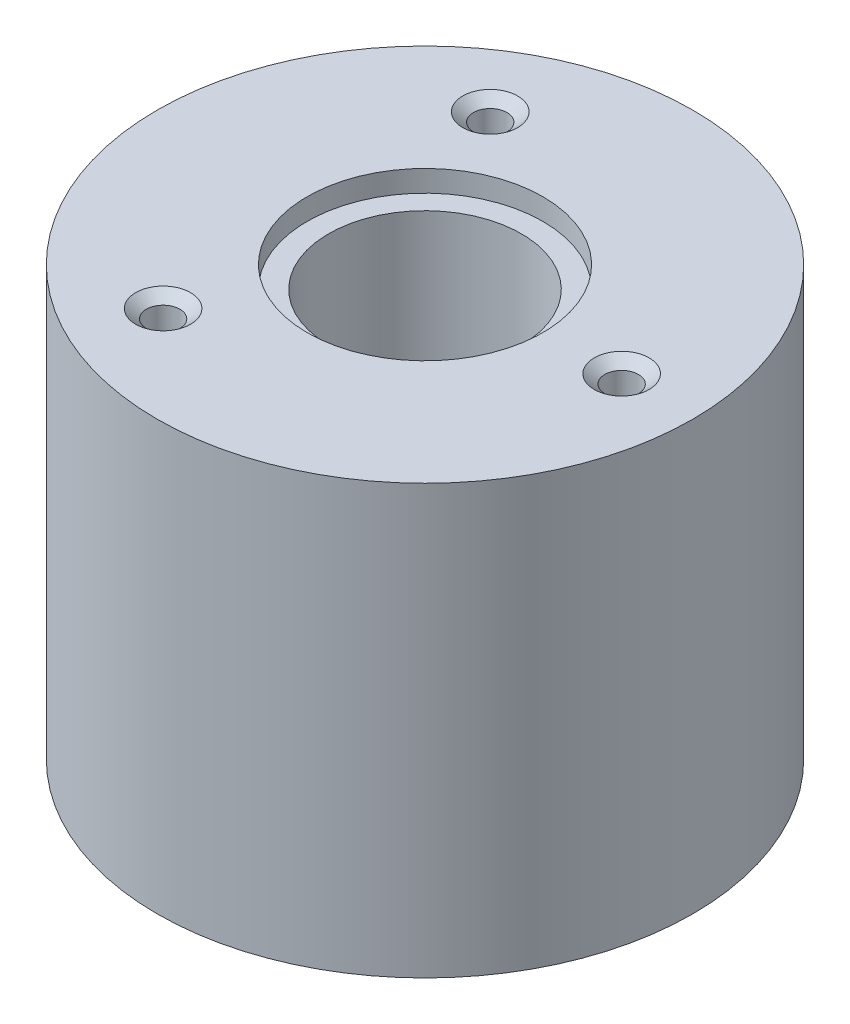
ISO-10303-21;
HEADER;
FILE_DESCRIPTION(('STEP AP214'),'2;1');
FILE_NAME('part.step','',(''),(''),'','','');
FILE_SCHEMA(('AUTOMOTIVE_DESIGN { 1 0 10303 214 1 1 1 1 }'));
ENDSEC;
DATA;
#1=APPLICATION_CONTEXT('core data for automotive mechanical design processes');
#2=APPLICATION_PROTOCOL_DEFINITION('international standard','automotive_design',2000,#1);
#3=PRODUCT_CONTEXT('',#1,'mechanical');
#4=PRODUCT('Part','Part','',(#3));
#5=PRODUCT_RELATED_PRODUCT_CATEGORY('part','',(#4));
#6=PRODUCT_DEFINITION_FORMATION('','',#4);
#7=PRODUCT_DEFINITION_CONTEXT('part definition',#1,'design');
#8=PRODUCT_DEFINITION('design','',#6,#7);
#9=PRODUCT_DEFINITION_SHAPE('','',#8);
#10=(LENGTH_UNIT() NAMED_UNIT(*) SI_UNIT(.MILLI.,.METRE.));
#11=(NAMED_UNIT(*) PLANE_ANGLE_UNIT() SI_UNIT($,.RADIAN.));
#12=(NAMED_UNIT(*) SI_UNIT($,.STERADIAN.) SOLID_ANGLE_UNIT());
#13=UNCERTAINTY_MEASURE_WITH_UNIT(LENGTH_MEASURE(1.E-05),#10,'distance_accuracy_value','');
#14=(GEOMETRIC_REPRESENTATION_CONTEXT(3) GLOBAL_UNCERTAINTY_ASSIGNED_CONTEXT((#13)) GLOBAL_UNIT_ASSIGNED_CONTEXT((#10,
#11,#12)) REPRESENTATION_CONTEXT('',''));
#15=CARTESIAN_POINT('',(0.,0.,0.));
#16=DIRECTION('',(0.,0.,1.));
#17=DIRECTION('',(1.,0.,0.));
#18=AXIS2_PLACEMENT_3D('',#15,#16,#17);
#19=CARTESIAN_POINT('',(0.,0.,0.));
#20=DIRECTION('',(0.,1.,0.));
#21=DIRECTION('',(0.,0.,1.));
#22=AXIS2_PLACEMENT_3D('',#19,#20,#21);
#23=CYLINDRICAL_SURFACE('',#22,5.715);
#24=CARTESIAN_POINT('',(0.,0.,0.));
#25=DIRECTION('',(0.,1.,0.));
#26=DIRECTION('',(0.,0.,1.));
#27=AXIS2_PLACEMENT_3D('',#24,#25,#26);
#28=CIRCLE('',#27,5.715);
#29=CARTESIAN_POINT('',(0.,0.,5.715));
#30=VERTEX_POINT('',#29);
#31=EDGE_CURVE('E141',#30,#30,#28,.T.);
#32=CARTESIAN_POINT('',(0.,24.13,0.));
#33=DIRECTION('',(0.,1.,0.));
#34=DIRECTION('',(0.,0.,1.));
#35=AXIS2_PLACEMENT_3D('',#32,#33,#34);
#36=CIRCLE('',#35,5.715);
#37=CARTESIAN_POINT('',(0.,24.13,5.715));
#38=VERTEX_POINT('',#37);
#39=EDGE_CURVE('E42',#38,#38,#36,.F.);
#40=CARTESIAN_POINT('',(0.,0.,5.715));
#41=CARTESIAN_POINT('',(0.,0.251354166666667,5.715));
#42=CARTESIAN_POINT('',(0.,0.502708333333333,5.715));
#43=CARTESIAN_POINT('',(0.,1.00541666666667,5.715));
#44=CARTESIAN_POINT('',(0.,1.25677083333333,5.715));
#45=CARTESIAN_POINT('',(0.,1.75947916666667,5.715));
#46=CARTESIAN_POINT('',(0.,2.01083333333333,5.715));
#47=CARTESIAN_POINT('',(0.,2.51354166666667,5.715));
#48=CARTESIAN_POINT('',(0.,2.76489583333333,5.715));
#49=CARTESIAN_POINT('',(0.,3.26760416666667,5.715));
#50=CARTESIAN_POINT('',(0.,3.51895833333333,5.715));
#51=CARTESIAN_POINT('',(0.,4.02166666666667,5.715));
#52=CARTESIAN_POINT('',(0.,4.27302083333333,5.715));
#53=CARTESIAN_POINT('',(0.,4.77572916666667,5.715));
#54=CARTESIAN_POINT('',(0.,5.02708333333333,5.715));
#55=CARTESIAN_POINT('',(0.,5.52979166666667,5.715));
#56=CARTESIAN_POINT('',(0.,5.78114583333333,5.715));
#57=CARTESIAN_POINT('',(0.,6.28385416666667,5.715));
#58=CARTESIAN_POINT('',(0.,6.53520833333333,5.715));
#59=CARTESIAN_POINT('',(0.,7.03791666666667,5.715));
#60=CARTESIAN_POINT('',(0.,7.28927083333333,5.715));
#61=CARTESIAN_POINT('',(0.,7.79197916666667,5.715));
#62=CARTESIAN_POINT('',(0.,8.04333333333333,5.715));
#63=CARTESIAN_POINT('',(0.,8.54604166666667,5.715));
#64=CARTESIAN_POINT('',(0.,8.79739583333333,5.715));
#65=CARTESIAN_POINT('',(0.,9.30010416666667,5.715));
#66=CARTESIAN_POINT('',(0.,9.55145833333333,5.715));
#67=CARTESIAN_POINT('',(0.,10.0541666666667,5.715));
#68=CARTESIAN_POINT('',(0.,10.3055208333333,5.715));
#69=CARTESIAN_POINT('',(0.,10.8082291666667,5.715));
#70=CARTESIAN_POINT('',(0.,11.0595833333333,5.715));
#71=CARTESIAN_POINT('',(0.,11.5622916666667,5.715));
#72=CARTESIAN_POINT('',(0.,11.8136458333333,5.715));
#73=CARTESIAN_POINT('',(0.,12.3163541666667,5.715));
#74=CARTESIAN_POINT('',(0.,12.5677083333333,5.715));
#75=CARTESIAN_POINT('',(0.,13.0704166666667,5.715));
#76=CARTESIAN_POINT('',(0.,13.3217708333333,5.715));
#77=CARTESIAN_POINT('',(0.,13.8244791666667,5.715));
#78=CARTESIAN_POINT('',(0.,14.0758333333333,5.715));
#79=CARTESIAN_POINT('',(0.,14.5785416666667,5.715));
#80=CARTESIAN_POINT('',(0.,14.8298958333333,5.715));
#81=CARTESIAN_POINT('',(0.,15.3326041666667,5.715));
#82=CARTESIAN_POINT('',(0.,15.5839583333333,5.715));
#83=CARTESIAN_POINT('',(0.,16.0866666666667,5.715));
#84=CARTESIAN_POINT('',(0.,16.3380208333333,5.715));
#85=CARTESIAN_POINT('',(0.,16.8407291666667,5.715));
#86=CARTESIAN_POINT('',(0.,17.0920833333333,5.715));
#87=CARTESIAN_POINT('',(0.,17.5947916666667,5.715));
#88=CARTESIAN_POINT('',(0.,17.8461458333333,5.715));
#89=CARTESIAN_POINT('',(0.,18.3488541666667,5.715));
#90=CARTESIAN_POINT('',(0.,18.6002083333333,5.715));
#91=CARTESIAN_POINT('',(0.,19.1029166666667,5.715));
#92=CARTESIAN_POINT('',(0.,19.3542708333333,5.715));
#93=CARTESIAN_POINT('',(0.,19.8569791666667,5.715));
#94=CARTESIAN_POINT('',(0.,20.1083333333333,5.715));
#95=CARTESIAN_POINT('',(0.,20.6110416666667,5.715));
#96=CARTESIAN_POINT('',(0.,20.8623958333333,5.715));
#97=CARTESIAN_POINT('',(0.,21.3651041666667,5.715));
#98=CARTESIAN_POINT('',(0.,21.6164583333333,5.715));
#99=CARTESIAN_POINT('',(0.,22.1191666666667,5.715));
#100=CARTESIAN_POINT('',(0.,22.3705208333333,5.715));
#101=CARTESIAN_POINT('',(0.,22.8732291666667,5.715));
#102=CARTESIAN_POINT('',(0.,23.1245833333333,5.715));
#103=CARTESIAN_POINT('',(0.,23.6272916666667,5.715));
#104=CARTESIAN_POINT('',(0.,23.8786458333333,5.715));
#105=CARTESIAN_POINT('',(0.,24.13,5.715));
#106=B_SPLINE_CURVE_WITH_KNOTS('',3,(#40,#41,#42,#43,#44,#45,#46,#47,#48,#49,#50,#51,#52,#53,
#54,#55,#56,#57,#58,#59,#60,#61,#62,#63,#64,#65,#66,#67,#68,#69,#70,#71,#72,#73,#74,#75,#76,#77,
#78,#79,#80,#81,#82,#83,#84,#85,#86,#87,#88,#89,#90,#91,#92,#93,#94,#95,#96,#97,#98,#99,#100,
#101,#102,#103,#104,#105),.UNSPECIFIED.,.F.,.F.,(4,2,2,2,2,2,2,2,2,2,2,2,2,2,2,2,2,2,2,2,2,2,2,
2,2,2,2,2,2,2,2,2,4),(0.,0.7540625,1.508125,2.2621875,3.01625,3.7703125,4.524375,5.2784375,
6.0325,6.7865625,7.540625,8.2946875,9.04875,9.8028125,10.556875,11.3109375,12.065,12.8190625,
13.573125,14.3271875,15.08125,15.8353125,16.589375,17.3434375,18.0975,18.8515625,19.605625,
20.3596875,21.11375,21.8678125,22.621875,23.3759375,24.13),.UNSPECIFIED.);
#107=EDGE_CURVE('BSEAM38',#30,#38,#106,.T.);
#108=ORIENTED_EDGE('',*,*,#31,.F.);
#109=ORIENTED_EDGE('',*,*,#39,.F.);
#110=ORIENTED_EDGE('',*,*,#107,.T.);
#111=ORIENTED_EDGE('',*,*,#107,.F.);
#112=EDGE_LOOP('',(#108,#110,#109,#111));
#113=FACE_BOUND('',#112,.T.);
#114=ADVANCED_FACE('F38',(#113),#23,.F.);
#115=CARTESIAN_POINT('',(0.,25.4,0.));
#116=DIRECTION('',(0.,-1.,0.));
#117=DIRECTION('',(0.,0.,-1.));
#118=AXIS2_PLACEMENT_3D('',#115,#116,#117);
#119=CYLINDRICAL_SURFACE('',#118,15.875);
#120=CARTESIAN_POINT('',(0.,25.4,0.));
#121=DIRECTION('',(0.,1.,0.));
#122=DIRECTION('',(0.,0.,1.));
#123=AXIS2_PLACEMENT_3D('',#120,#121,#122);
#124=CIRCLE('',#123,15.875);
#125=CARTESIAN_POINT('',(0.,25.4,-15.875));
#126=VERTEX_POINT('',#125);
#127=EDGE_CURVE('E11',#126,#126,#124,.T.);
#128=CARTESIAN_POINT('',(0.,0.,0.));
#129=DIRECTION('',(0.,1.,0.));
#130=DIRECTION('',(0.,0.,1.));
#131=AXIS2_PLACEMENT_3D('',#128,#129,#130);
#132=CIRCLE('',#131,15.875);
#133=CARTESIAN_POINT('',(0.,0.,-15.875));
#134=VERTEX_POINT('',#133);
#135=EDGE_CURVE('E47',#134,#134,#132,.T.);
#136=CARTESIAN_POINT('',(0.,25.4,-15.875));
#137=CARTESIAN_POINT('',(0.,25.1354166666667,-15.875));
#138=CARTESIAN_POINT('',(0.,24.8708333333333,-15.875));
#139=CARTESIAN_POINT('',(0.,24.3416666666667,-15.875));
#140=CARTESIAN_POINT('',(0.,24.0770833333333,-15.875));
#141=CARTESIAN_POINT('',(0.,23.5479166666667,-15.875));
#142=CARTESIAN_POINT('',(0.,23.2833333333333,-15.875));
#143=CARTESIAN_POINT('',(0.,22.7541666666667,-15.875));
#144=CARTESIAN_POINT('',(0.,22.4895833333333,-15.875));
#145=CARTESIAN_POINT('',(0.,21.9604166666667,-15.875));
#146=CARTESIAN_POINT('',(0.,21.6958333333333,-15.875));
#147=CARTESIAN_POINT('',(0.,21.1666666666667,-15.875));
#148=CARTESIAN_POINT('',(0.,20.9020833333333,-15.875));
#149=CARTESIAN_POINT('',(0.,20.3729166666667,-15.875));
#150=CARTESIAN_POINT('',(0.,20.1083333333333,-15.875));
#151=CARTESIAN_POINT('',(0.,19.5791666666667,-15.875));
#152=CARTESIAN_POINT('',(0.,19.3145833333333,-15.875));
#153=CARTESIAN_POINT('',(0.,18.7854166666667,-15.875));
#154=CARTESIAN_POINT('',(0.,18.5208333333333,-15.875));
#155=CARTESIAN_POINT('',(0.,17.9916666666667,-15.875));
#156=CARTESIAN_POINT('',(0.,17.7270833333333,-15.875));
#157=CARTESIAN_POINT('',(0.,17.1979166666667,-15.875));
#158=CARTESIAN_POINT('',(0.,16.9333333333333,-15.875));
#159=CARTESIAN_POINT('',(0.,16.4041666666667,-15.875));
#160=CARTESIAN_POINT('',(0.,16.1395833333333,-15.875));
#161=CARTESIAN_POINT('',(0.,15.6104166666667,-15.875));
#162=CARTESIAN_POINT('',(0.,15.3458333333333,-15.875));
#163=CARTESIAN_POINT('',(0.,14.8166666666667,-15.875));
#164=CARTESIAN_POINT('',(0.,14.5520833333333,-15.875));
#165=CARTESIAN_POINT('',(0.,14.0229166666667,-15.875));
#166=CARTESIAN_POINT('',(0.,13.7583333333333,-15.875));
#167=CARTESIAN_POINT('',(0.,13.2291666666667,-15.875));
#168=CARTESIAN_POINT('',(0.,12.9645833333333,-15.875));
#169=CARTESIAN_POINT('',(0.,12.4354166666667,-15.875));
#170=CARTESIAN_POINT('',(0.,12.1708333333333,-15.875));
#171=CARTESIAN_POINT('',(0.,11.6416666666667,-15.875));
#172=CARTESIAN_POINT('',(0.,11.3770833333333,-15.875));
#173=CARTESIAN_POINT('',(0.,10.8479166666667,-15.875));
#174=CARTESIAN_POINT('',(0.,10.5833333333333,-15.875));
#175=CARTESIAN_POINT('',(0.,10.0541666666667,-15.875));
#176=CARTESIAN_POINT('',(0.,9.78958333333334,-15.875));
#177=CARTESIAN_POINT('',(0.,9.26041666666667,-15.875));
#178=CARTESIAN_POINT('',(0.,8.99583333333333,-15.875));
#179=CARTESIAN_POINT('',(0.,8.46666666666667,-15.875));
#180=CARTESIAN_POINT('',(0.,8.20208333333333,-15.875));
#181=CARTESIAN_POINT('',(0.,7.67291666666667,-15.875));
#182=CARTESIAN_POINT('',(0.,7.40833333333333,-15.875));
#183=CARTESIAN_POINT('',(0.,6.87916666666667,-15.875));
#184=CARTESIAN_POINT('',(0.,6.61458333333333,-15.875));
#185=CARTESIAN_POINT('',(0.,6.08541666666667,-15.875));
#186=CARTESIAN_POINT('',(0.,5.82083333333333,-15.875));
#187=CARTESIAN_POINT('',(0.,5.29166666666667,-15.875));
#188=CARTESIAN_POINT('',(0.,5.02708333333333,-15.875));
#189=CARTESIAN_POINT('',(0.,4.49791666666667,-15.875));
#190=CARTESIAN_POINT('',(0.,4.23333333333333,-15.875));
#191=CARTESIAN_POINT('',(0.,3.70416666666667,-15.875));
#192=CARTESIAN_POINT('',(0.,3.43958333333333,-15.875));
#193=CARTESIAN_POINT('',(0.,2.91041666666667,-15.875));
#194=CARTESIAN_POINT('',(0.,2.64583333333333,-15.875));
#195=CARTESIAN_POINT('',(0.,2.11666666666667,-15.875));
#196=CARTESIAN_POINT('',(0.,1.85208333333333,-15.875));
#197=CARTESIAN_POINT('',(0.,1.32291666666667,-15.875));
#198=CARTESIAN_POINT('',(0.,1.05833333333333,-15.875));
#199=CARTESIAN_POINT('',(0.,0.529166666666666,-15.875));
#200=CARTESIAN_POINT('',(0.,0.264583333333333,-15.875));
#201=CARTESIAN_POINT('',(0.,0.,-15.875));
#202=B_SPLINE_CURVE_WITH_KNOTS('',3,(#136,#137,#138,#139,#140,#141,#142,#143,#144,#145,#146,
#147,#148,#149,#150,#151,#152,#153,#154,#155,#156,#157,#158,#159,#160,#161,#162,#163,#164,#165,
#166,#167,#168,#169,#170,#171,#172,#173,#174,#175,#176,#177,#178,#179,#180,#181,#182,#183,#184,
#185,#186,#187,#188,#189,#190,#191,#192,#193,#194,#195,#196,#197,#198,#199,#200,#201),
.UNSPECIFIED.,.F.,.F.,(4,2,2,2,2,2,2,2,2,2,2,2,2,2,2,2,2,2,2,2,2,2,2,2,2,2,2,2,2,2,2,2,4),(0.,
0.793749999999999,1.5875,2.38125,3.175,3.96875,4.7625,5.55625,6.35,7.14375,7.9375,8.73125,9.525,
10.31875,11.1125,11.90625,12.7,13.49375,14.2875,15.08125,15.875,16.66875,17.4625,18.25625,19.05,
19.84375,20.6375,21.43125,22.225,23.01875,23.8125,24.60625,25.4),.UNSPECIFIED.);
#203=EDGE_CURVE('BSEAM40',#126,#134,#202,.T.);
#204=ORIENTED_EDGE('',*,*,#127,.F.);
#205=ORIENTED_EDGE('',*,*,#135,.T.);
#206=ORIENTED_EDGE('',*,*,#203,.T.);
#207=ORIENTED_EDGE('',*,*,#203,.F.);
#208=EDGE_LOOP('',(#204,#206,#205,#207));
#209=FACE_BOUND('',#208,.T.);
#210=ADVANCED_FACE('F40',(#209),#119,.T.);
#211=CARTESIAN_POINT('',(0.,25.4,0.));
#212=DIRECTION('',(0.,1.,0.));
#213=DIRECTION('',(0.,0.,1.));
#214=AXIS2_PLACEMENT_3D('',#211,#212,#213);
#215=PLANE('',#214);
#216=CARTESIAN_POINT('',(-5.51347809915412,25.4,10.0123153790793));
#217=DIRECTION('',(0.,1.,0.));
#218=DIRECTION('',(0.,0.,1.));
#219=AXIS2_PLACEMENT_3D('',#216,#217,#218);
#220=CIRCLE('',#219,1.627251);
#221=CARTESIAN_POINT('',(-5.51347809915412,25.4,11.6395663790793));
#222=VERTEX_POINT('',#221);
#223=EDGE_CURVE('E96',#222,#222,#220,.T.);
#224=ORIENTED_EDGE('',*,*,#223,.F.);
#225=EDGE_LOOP('',(#224));
#226=FACE_BOUND('',#225,.T.);
#227=CARTESIAN_POINT('',(11.4276585185614,25.4,-0.231345592463095));
#228=DIRECTION('',(0.,1.,0.));
#229=DIRECTION('',(0.,0.,1.));
#230=AXIS2_PLACEMENT_3D('',#227,#228,#229);
#231=CIRCLE('',#230,1.627251);
#232=CARTESIAN_POINT('',(11.4276585185614,25.4,1.3959054075369));
#233=VERTEX_POINT('',#232);
#234=EDGE_CURVE('E105',#233,#233,#231,.T.);
#235=ORIENTED_EDGE('',*,*,#234,.F.);
#236=EDGE_LOOP('',(#235));
#237=FACE_BOUND('',#236,.T.);
#238=CARTESIAN_POINT('',(-5.91418041940732,25.4,-9.7809697866162));
#239=DIRECTION('',(0.,1.,0.));
#240=DIRECTION('',(0.,0.,1.));
#241=AXIS2_PLACEMENT_3D('',#238,#239,#240);
#242=CIRCLE('',#241,1.627251);
#243=CARTESIAN_POINT('',(-5.91418041940732,25.4,-8.1537187866162));
#244=VERTEX_POINT('',#243);
#245=EDGE_CURVE('E114',#244,#244,#242,.T.);
#246=ORIENTED_EDGE('',*,*,#245,.F.);
#247=EDGE_LOOP('',(#246));
#248=FACE_BOUND('',#247,.T.);
#249=CARTESIAN_POINT('',(0.,25.4,0.));
#250=DIRECTION('',(0.,1.,0.));
#251=DIRECTION('',(0.,0.,1.));
#252=AXIS2_PLACEMENT_3D('',#249,#250,#251);
#253=CIRCLE('',#252,6.985);
#254=CARTESIAN_POINT('',(0.,25.4,6.985));
#255=VERTEX_POINT('',#254);
#256=EDGE_CURVE('E135',#255,#255,#253,.T.);
#257=ORIENTED_EDGE('',*,*,#256,.F.);
#258=EDGE_LOOP('',(#257));
#259=FACE_BOUND('',#258,.T.);
#260=ORIENTED_EDGE('',*,*,#127,.T.);
#261=EDGE_LOOP('',(#260));
#262=FACE_BOUND('',#261,.T.);
#263=ADVANCED_FACE('F150',(#226,#237,#248,#259,#262),#215,.T.);
#264=CARTESIAN_POINT('',(0.,0.,0.));
#265=DIRECTION('',(0.,1.,0.));
#266=DIRECTION('',(0.,0.,1.));
#267=AXIS2_PLACEMENT_3D('',#264,#265,#266);
#268=PLANE('',#267);
#269=CARTESIAN_POINT('',(3.21402259693411,0.,10.6375615155165));
#270=DIRECTION('',(0.,-1.,0.));
#271=DIRECTION('',(0.,0.,-1.));
#272=AXIS2_PLACEMENT_3D('',#269,#270,#271);
#273=CIRCLE('',#272,1.42875);
#274=CARTESIAN_POINT('',(3.21402259693411,0.,9.20881151551646));
#275=VERTEX_POINT('',#274);
#276=EDGE_CURVE('E87',#275,#275,#273,.T.);
#277=ORIENTED_EDGE('',*,*,#276,.F.);
#278=EDGE_LOOP('',(#277));
#279=FACE_BOUND('',#278,.T.);
#280=CARTESIAN_POINT('',(-3.21402259693411,0.,-10.6375615155165));
#281=DIRECTION('',(0.,-1.,0.));
#282=DIRECTION('',(0.,0.,-1.));
#283=AXIS2_PLACEMENT_3D('',#280,#281,#282);
#284=CIRCLE('',#283,1.42875);
#285=CARTESIAN_POINT('',(-3.21402259693411,0.,-12.0663115155165));
#286=VERTEX_POINT('',#285);
#287=EDGE_CURVE('E80',#286,#286,#284,.T.);
#288=ORIENTED_EDGE('',*,*,#287,.F.);
#289=EDGE_LOOP('',(#288));
#290=FACE_BOUND('',#289,.T.);
#291=CARTESIAN_POINT('',(-8.91738444421453,0.,-6.43673098991826));
#292=DIRECTION('',(0.,-1.,0.));
#293=DIRECTION('',(0.,0.,-1.));
#294=AXIS2_PLACEMENT_3D('',#291,#292,#293);
#295=CIRCLE('',#294,3.17499999999999);
#296=CARTESIAN_POINT('',(-8.91738444421453,0.,-9.61173098991825));
#297=VERTEX_POINT('',#296);
#298=EDGE_CURVE('E123',#297,#297,#295,.T.);
#299=ORIENTED_EDGE('',*,*,#298,.F.);
#300=EDGE_LOOP('',(#299));
#301=FACE_BOUND('',#300,.T.);
#302=CARTESIAN_POINT('',(8.91738444421453,0.,6.43673098991826));
#303=DIRECTION('',(0.,-1.,0.));
#304=DIRECTION('',(0.,0.,-1.));
#305=AXIS2_PLACEMENT_3D('',#302,#303,#304);
#306=CIRCLE('',#305,3.17499999999999);
#307=CARTESIAN_POINT('',(8.91738444421453,0.,3.26173098991827));
#308=VERTEX_POINT('',#307);
#309=EDGE_CURVE('E129',#308,#308,#306,.T.);
#310=ORIENTED_EDGE('',*,*,#309,.F.);
#311=EDGE_LOOP('',(#310));
#312=FACE_BOUND('',#311,.T.);
#313=ORIENTED_EDGE('',*,*,#31,.T.);
#314=EDGE_LOOP('',(#313));
#315=FACE_BOUND('',#314,.T.);
#316=ORIENTED_EDGE('',*,*,#135,.F.);
#317=EDGE_LOOP('',(#316));
#318=FACE_BOUND('',#317,.T.);
#319=ADVANCED_FACE('F147',(#279,#290,#301,#312,#315,#318),#268,.F.);
#320=CARTESIAN_POINT('',(0.,24.13,0.));
#321=DIRECTION('',(0.,1.,0.));
#322=DIRECTION('',(0.,0.,1.));
#323=AXIS2_PLACEMENT_3D('',#320,#321,#322);
#324=PLANE('',#323);
#325=CARTESIAN_POINT('',(0.,24.13,0.));
#326=DIRECTION('',(0.,1.,0.));
#327=DIRECTION('',(0.,0.,1.));
#328=AXIS2_PLACEMENT_3D('',#325,#326,#327);
#329=CIRCLE('',#328,6.985);
#330=CARTESIAN_POINT('',(0.,24.13,6.985));
#331=VERTEX_POINT('',#330);
#332=EDGE_CURVE('E136',#331,#331,#329,.T.);
#333=ORIENTED_EDGE('',*,*,#332,.T.);
#334=EDGE_LOOP('',(#333));
#335=FACE_BOUND('',#334,.T.);
#336=ORIENTED_EDGE('',*,*,#39,.T.);
#337=EDGE_LOOP('',(#336));
#338=FACE_BOUND('',#337,.T.);
#339=ADVANCED_FACE('F149',(#335,#338),#324,.T.);
#340=CARTESIAN_POINT('',(0.,24.13,0.));
#341=DIRECTION('',(0.,1.,0.));
#342=DIRECTION('',(0.,0.,1.));
#343=AXIS2_PLACEMENT_3D('',#340,#341,#342);
#344=CYLINDRICAL_SURFACE('',#343,6.985);
#345=ORIENTED_EDGE('',*,*,#332,.F.);
#346=EDGE_LOOP('',(#345));
#347=FACE_BOUND('',#346,.T.);
#348=ORIENTED_EDGE('',*,*,#256,.T.);
#349=EDGE_LOOP('',(#348));
#350=FACE_BOUND('',#349,.T.);
#351=ADVANCED_FACE('F156',(#347,#350),#344,.F.);
#352=CARTESIAN_POINT('',(8.91738444421453,19.05,6.43673098991826));
#353=DIRECTION('',(0.,-1.,0.));
#354=DIRECTION('',(0.,0.,-1.));
#355=AXIS2_PLACEMENT_3D('',#352,#353,#354);
#356=CONICAL_SURFACE('',#355,3.17499999999999,1.02974425867665);
#357=CARTESIAN_POINT('',(8.91738444421452,20.9577324654125,6.43673098991826));
#358=VERTEX_POINT('',#357);
#359=VERTEX_LOOP('',#358);
#360=FACE_BOUND('',#359,.T.);
#361=CARTESIAN_POINT('',(8.91738444421453,19.05,6.43673098991826));
#362=DIRECTION('',(0.,-1.,0.));
#363=DIRECTION('',(0.,0.,-1.));
#364=AXIS2_PLACEMENT_3D('',#361,#362,#363);
#365=CIRCLE('',#364,3.17499999999999);
#366=CARTESIAN_POINT('',(8.91738444421453,19.05,3.26173098991827));
#367=VERTEX_POINT('',#366);
#368=EDGE_CURVE('E132',#367,#367,#365,.T.);
#369=ORIENTED_EDGE('',*,*,#368,.T.);
#370=EDGE_LOOP('',(#369));
#371=FACE_BOUND('',#370,.T.);
#372=ADVANCED_FACE('F174',(#360,#371),#356,.F.);
#373=CARTESIAN_POINT('',(8.91738444421453,0.,6.43673098991826));
#374=DIRECTION('',(0.,-1.,0.));
#375=DIRECTION('',(0.,0.,-1.));
#376=AXIS2_PLACEMENT_3D('',#373,#374,#375);
#377=CYLINDRICAL_SURFACE('',#376,3.17499999999999);
#378=ORIENTED_EDGE('',*,*,#368,.F.);
#379=EDGE_LOOP('',(#378));
#380=FACE_BOUND('',#379,.T.);
#381=ORIENTED_EDGE('',*,*,#309,.T.);
#382=EDGE_LOOP('',(#381));
#383=FACE_BOUND('',#382,.T.);
#384=ADVANCED_FACE('F179',(#380,#383),#377,.F.);
#385=CARTESIAN_POINT('',(-8.91738444421453,19.05,-6.43673098991826));
#386=DIRECTION('',(0.,-1.,0.));
#387=DIRECTION('',(0.,0.,-1.));
#388=AXIS2_PLACEMENT_3D('',#385,#386,#387);
#389=CONICAL_SURFACE('',#388,3.17499999999999,1.02974425867665);
#390=CARTESIAN_POINT('',(-8.91738444421453,20.9577324654125,-6.43673098991826));
#391=VERTEX_POINT('',#390);
#392=VERTEX_LOOP('',#391);
#393=FACE_BOUND('',#392,.T.);
#394=CARTESIAN_POINT('',(-8.91738444421453,19.05,-6.43673098991826));
#395=DIRECTION('',(0.,-1.,0.));
#396=DIRECTION('',(0.,0.,-1.));
#397=AXIS2_PLACEMENT_3D('',#394,#395,#396);
#398=CIRCLE('',#397,3.17499999999999);
#399=CARTESIAN_POINT('',(-8.91738444421453,19.05,-9.61173098991824));
#400=VERTEX_POINT('',#399);
#401=EDGE_CURVE('E126',#400,#400,#398,.T.);
#402=ORIENTED_EDGE('',*,*,#401,.T.);
#403=EDGE_LOOP('',(#402));
#404=FACE_BOUND('',#403,.T.);
#405=ADVANCED_FACE('F182',(#393,#404),#389,.F.);
#406=CARTESIAN_POINT('',(-8.91738444421453,0.,-6.43673098991826));
#407=DIRECTION('',(0.,-1.,0.));
#408=DIRECTION('',(0.,0.,-1.));
#409=AXIS2_PLACEMENT_3D('',#406,#407,#408);
#410=CYLINDRICAL_SURFACE('',#409,3.17499999999999);
#411=ORIENTED_EDGE('',*,*,#401,.F.);
#412=EDGE_LOOP('',(#411));
#413=FACE_BOUND('',#412,.T.);
#414=ORIENTED_EDGE('',*,*,#298,.T.);
#415=EDGE_LOOP('',(#414));
#416=FACE_BOUND('',#415,.T.);
#417=ADVANCED_FACE('F186',(#413,#416),#410,.F.);
#418=CARTESIAN_POINT('',(-5.91418041940732,15.24,-9.7809697866162));
#419=DIRECTION('',(0.,1.,0.));
#420=DIRECTION('',(0.,0.,1.));
#421=AXIS2_PLACEMENT_3D('',#418,#419,#420);
#422=CONICAL_SURFACE('',#421,0.992250999999998,1.02974425867665);
#423=CARTESIAN_POINT('',(-5.91418041940733,14.6437954499093,-9.7809697866162));
#424=VERTEX_POINT('',#423);
#425=VERTEX_LOOP('',#424);
#426=FACE_BOUND('',#425,.T.);
#427=CARTESIAN_POINT('',(-5.91418041940732,15.24,-9.7809697866162));
#428=DIRECTION('',(0.,1.,0.));
#429=DIRECTION('',(0.,0.,1.));
#430=AXIS2_PLACEMENT_3D('',#427,#428,#429);
#431=CIRCLE('',#430,0.992250999999998);
#432=CARTESIAN_POINT('',(-5.91418041940732,15.24,-8.78871878661621));
#433=VERTEX_POINT('',#432);
#434=EDGE_CURVE('E120',#433,#433,#431,.T.);
#435=ORIENTED_EDGE('',*,*,#434,.T.);
#436=EDGE_LOOP('',(#435));
#437=FACE_BOUND('',#436,.T.);
#438=ADVANCED_FACE('F189',(#426,#437),#422,.F.);
#439=CARTESIAN_POINT('',(-5.91418041940732,25.4,-9.7809697866162));
#440=DIRECTION('',(0.,1.,0.));
#441=DIRECTION('',(0.,0.,1.));
#442=AXIS2_PLACEMENT_3D('',#439,#440,#441);
#443=CYLINDRICAL_SURFACE('',#442,0.992250999999998);
#444=ORIENTED_EDGE('',*,*,#434,.F.);
#445=EDGE_LOOP('',(#444));
#446=FACE_BOUND('',#445,.T.);
#447=CARTESIAN_POINT('',(-5.91418041940732,24.8671717342024,-9.7809697866162));
#448=DIRECTION('',(0.,1.,0.));
#449=DIRECTION('',(0.,0.,1.));
#450=AXIS2_PLACEMENT_3D('',#447,#448,#449);
#451=CIRCLE('',#450,0.992250999999999);
#452=CARTESIAN_POINT('',(-5.91418041940732,24.8671717342024,-8.7887187866162));
#453=VERTEX_POINT('',#452);
#454=EDGE_CURVE('E117',#453,#453,#451,.T.);
#455=ORIENTED_EDGE('',*,*,#454,.T.);
#456=EDGE_LOOP('',(#455));
#457=FACE_BOUND('',#456,.T.);
#458=ADVANCED_FACE('F193',(#446,#457),#443,.F.);
#459=CARTESIAN_POINT('',(-5.91418041940732,25.4,-9.7809697866162));
#460=DIRECTION('',(0.,1.,0.));
#461=DIRECTION('',(0.,0.,1.));
#462=AXIS2_PLACEMENT_3D('',#459,#460,#461);
#463=CONICAL_SURFACE('',#462,1.627251,0.872664625997164);
#464=ORIENTED_EDGE('',*,*,#454,.F.);
#465=EDGE_LOOP('',(#464));
#466=FACE_BOUND('',#465,.T.);
#467=ORIENTED_EDGE('',*,*,#245,.T.);
#468=EDGE_LOOP('',(#467));
#469=FACE_BOUND('',#468,.T.);
#470=ADVANCED_FACE('F197',(#466,#469),#463,.F.);
#471=CARTESIAN_POINT('',(11.4276585185614,15.24,-0.231345592463095));
#472=DIRECTION('',(0.,1.,0.));
#473=DIRECTION('',(0.,0.,1.));
#474=AXIS2_PLACEMENT_3D('',#471,#472,#473);
#475=CONICAL_SURFACE('',#474,0.992250999999998,1.02974425867665);
#476=CARTESIAN_POINT('',(11.4276585185614,14.6437954499093,-0.231345592463095));
#477=VERTEX_POINT('',#476);
#478=VERTEX_LOOP('',#477);
#479=FACE_BOUND('',#478,.T.);
#480=CARTESIAN_POINT('',(11.4276585185614,15.24,-0.231345592463095));
#481=DIRECTION('',(0.,1.,0.));
#482=DIRECTION('',(0.,0.,1.));
#483=AXIS2_PLACEMENT_3D('',#480,#481,#482);
#484=CIRCLE('',#483,0.992250999999998);
#485=CARTESIAN_POINT('',(11.4276585185614,15.24,0.760905407536903));
#486=VERTEX_POINT('',#485);
#487=EDGE_CURVE('E111',#486,#486,#484,.T.);
#488=ORIENTED_EDGE('',*,*,#487,.T.);
#489=EDGE_LOOP('',(#488));
#490=FACE_BOUND('',#489,.T.);
#491=ADVANCED_FACE('F201',(#479,#490),#475,.F.);
#492=CARTESIAN_POINT('',(11.4276585185614,25.4,-0.231345592463095));
#493=DIRECTION('',(0.,1.,0.));
#494=DIRECTION('',(0.,0.,1.));
#495=AXIS2_PLACEMENT_3D('',#492,#493,#494);
#496=CYLINDRICAL_SURFACE('',#495,0.992250999999998);
#497=ORIENTED_EDGE('',*,*,#487,.F.);
#498=EDGE_LOOP('',(#497));
#499=FACE_BOUND('',#498,.T.);
#500=CARTESIAN_POINT('',(11.4276585185614,24.8671717342024,-0.231345592463095));
#501=DIRECTION('',(0.,1.,0.));
#502=DIRECTION('',(0.,0.,1.));
#503=AXIS2_PLACEMENT_3D('',#500,#501,#502);
#504=CIRCLE('',#503,0.992250999999998);
#505=CARTESIAN_POINT('',(11.4276585185614,24.8671717342024,0.760905407536903));
#506=VERTEX_POINT('',#505);
#507=EDGE_CURVE('E108',#506,#506,#504,.T.);
#508=ORIENTED_EDGE('',*,*,#507,.T.);
#509=EDGE_LOOP('',(#508));
#510=FACE_BOUND('',#509,.T.);
#511=ADVANCED_FACE('F205',(#499,#510),#496,.F.);
#512=CARTESIAN_POINT('',(11.4276585185614,25.4,-0.231345592463095));
#513=DIRECTION('',(0.,1.,0.));
#514=DIRECTION('',(0.,0.,1.));
#515=AXIS2_PLACEMENT_3D('',#512,#513,#514);
#516=CONICAL_SURFACE('',#515,1.627251,0.872664625997165);
#517=ORIENTED_EDGE('',*,*,#507,.F.);
#518=EDGE_LOOP('',(#517));
#519=FACE_BOUND('',#518,.T.);
#520=ORIENTED_EDGE('',*,*,#234,.T.);
#521=EDGE_LOOP('',(#520));
#522=FACE_BOUND('',#521,.T.);
#523=ADVANCED_FACE('F209',(#519,#522),#516,.F.);
#524=CARTESIAN_POINT('',(-5.51347809915412,15.24,10.0123153790793));
#525=DIRECTION('',(0.,1.,0.));
#526=DIRECTION('',(0.,0.,1.));
#527=AXIS2_PLACEMENT_3D('',#524,#525,#526);
#528=CONICAL_SURFACE('',#527,0.992250999999998,1.02974425867665);
#529=CARTESIAN_POINT('',(-5.51347809915413,14.6437954499093,10.0123153790793));
#530=VERTEX_POINT('',#529);
#531=VERTEX_LOOP('',#530);
#532=FACE_BOUND('',#531,.T.);
#533=CARTESIAN_POINT('',(-5.51347809915412,15.24,10.0123153790793));
#534=DIRECTION('',(0.,1.,0.));
#535=DIRECTION('',(0.,0.,1.));
#536=AXIS2_PLACEMENT_3D('',#533,#534,#535);
#537=CIRCLE('',#536,0.992250999999998);
#538=CARTESIAN_POINT('',(-5.51347809915412,15.24,11.0045663790793));
#539=VERTEX_POINT('',#538);
#540=EDGE_CURVE('E102',#539,#539,#537,.T.);
#541=ORIENTED_EDGE('',*,*,#540,.T.);
#542=EDGE_LOOP('',(#541));
#543=FACE_BOUND('',#542,.T.);
#544=ADVANCED_FACE('F213',(#532,#543),#528,.F.);
#545=CARTESIAN_POINT('',(-5.51347809915412,25.4,10.0123153790793));
#546=DIRECTION('',(0.,1.,0.));
#547=DIRECTION('',(0.,0.,1.));
#548=AXIS2_PLACEMENT_3D('',#545,#546,#547);
#549=CYLINDRICAL_SURFACE('',#548,0.992250999999998);
#550=ORIENTED_EDGE('',*,*,#540,.F.);
#551=EDGE_LOOP('',(#550));
#552=FACE_BOUND('',#551,.T.);
#553=CARTESIAN_POINT('',(-5.51347809915412,24.8671717342024,10.0123153790793));
#554=DIRECTION('',(0.,1.,0.));
#555=DIRECTION('',(0.,0.,1.));
#556=AXIS2_PLACEMENT_3D('',#553,#554,#555);
#557=CIRCLE('',#556,0.992250999999999);
#558=CARTESIAN_POINT('',(-5.51347809915412,24.8671717342024,11.0045663790793));
#559=VERTEX_POINT('',#558);
#560=EDGE_CURVE('E99',#559,#559,#557,.T.);
#561=ORIENTED_EDGE('',*,*,#560,.T.);
#562=EDGE_LOOP('',(#561));
#563=FACE_BOUND('',#562,.T.);
#564=ADVANCED_FACE('F217',(#552,#563),#549,.F.);
#565=CARTESIAN_POINT('',(-5.51347809915412,25.4,10.0123153790793));
#566=DIRECTION('',(0.,1.,0.));
#567=DIRECTION('',(0.,0.,1.));
#568=AXIS2_PLACEMENT_3D('',#565,#566,#567);
#569=CONICAL_SURFACE('',#568,1.627251,0.872664625997164);
#570=ORIENTED_EDGE('',*,*,#560,.F.);
#571=EDGE_LOOP('',(#570));
#572=FACE_BOUND('',#571,.T.);
#573=ORIENTED_EDGE('',*,*,#223,.T.);
#574=EDGE_LOOP('',(#573));
#575=FACE_BOUND('',#574,.T.);
#576=ADVANCED_FACE('F221',(#572,#575),#569,.F.);
#577=CARTESIAN_POINT('',(-3.21402259693411,12.7,-10.6375615155165));
#578=DIRECTION('',(0.,-1.,0.));
#579=DIRECTION('',(0.,0.,-1.));
#580=AXIS2_PLACEMENT_3D('',#577,#578,#579);
#581=CONICAL_SURFACE('',#580,0.793749999999997,1.02974425867665);
#582=CARTESIAN_POINT('',(-3.21402259693412,13.1769331163531,-10.6375615155165));
#583=VERTEX_POINT('',#582);
#584=VERTEX_LOOP('',#583);
#585=FACE_BOUND('',#584,.T.);
#586=CARTESIAN_POINT('',(-3.21402259693411,12.7,-10.6375615155165));
#587=DIRECTION('',(0.,-1.,0.));
#588=DIRECTION('',(0.,0.,-1.));
#589=AXIS2_PLACEMENT_3D('',#586,#587,#588);
#590=CIRCLE('',#589,0.793749999999997);
#591=CARTESIAN_POINT('',(-3.21402259693411,12.7,-11.4313115155165));
#592=VERTEX_POINT('',#591);
#593=EDGE_CURVE('E93',#592,#592,#590,.T.);
#594=ORIENTED_EDGE('',*,*,#593,.T.);
#595=EDGE_LOOP('',(#594));
#596=FACE_BOUND('',#595,.T.);
#597=ADVANCED_FACE('F225',(#585,#596),#581,.F.);
#598=CARTESIAN_POINT('',(-3.21402259693411,0.,-10.6375615155165));
#599=DIRECTION('',(0.,-1.,0.));
#600=DIRECTION('',(0.,0.,-1.));
#601=AXIS2_PLACEMENT_3D('',#598,#599,#600);
#602=CYLINDRICAL_SURFACE('',#601,0.793749999999997);
#603=ORIENTED_EDGE('',*,*,#593,.F.);
#604=EDGE_LOOP('',(#603));
#605=FACE_BOUND('',#604,.T.);
#606=CARTESIAN_POINT('',(-3.21402259693411,0.532828265797574,-10.6375615155165));
#607=DIRECTION('',(0.,-1.,0.));
#608=DIRECTION('',(0.,0.,-1.));
#609=AXIS2_PLACEMENT_3D('',#606,#607,#608);
#610=CIRCLE('',#609,0.793749999999997);
#611=CARTESIAN_POINT('',(-3.21402259693411,0.532828265797574,-11.4313115155165));
#612=VERTEX_POINT('',#611);
#613=EDGE_CURVE('E84',#612,#612,#610,.T.);
#614=ORIENTED_EDGE('',*,*,#613,.T.);
#615=EDGE_LOOP('',(#614));
#616=FACE_BOUND('',#615,.T.);
#617=ADVANCED_FACE('F229',(#605,#616),#602,.F.);
#618=CARTESIAN_POINT('',(-3.21402259693411,0.,-10.6375615155165));
#619=DIRECTION('',(0.,-1.,0.));
#620=DIRECTION('',(0.,0.,-1.));
#621=AXIS2_PLACEMENT_3D('',#618,#619,#620);
#622=CONICAL_SURFACE('',#621,1.42875,0.872664625997164);
#623=ORIENTED_EDGE('',*,*,#613,.F.);
#624=EDGE_LOOP('',(#623));
#625=FACE_BOUND('',#624,.T.);
#626=ORIENTED_EDGE('',*,*,#287,.T.);
#627=EDGE_LOOP('',(#626));
#628=FACE_BOUND('',#627,.T.);
#629=ADVANCED_FACE('F74',(#625,#628),#622,.F.);
#630=CARTESIAN_POINT('',(3.21402259693411,12.7,10.6375615155165));
#631=DIRECTION('',(0.,-1.,0.));
#632=DIRECTION('',(0.,0.,-1.));
#633=AXIS2_PLACEMENT_3D('',#630,#631,#632);
#634=CONICAL_SURFACE('',#633,0.793749999999997,1.02974425867665);
#635=CARTESIAN_POINT('',(3.21402259693411,13.1769331163531,10.6375615155165));
#636=VERTEX_POINT('',#635);
#637=VERTEX_LOOP('',#636);
#638=FACE_BOUND('',#637,.T.);
#639=CARTESIAN_POINT('',(3.21402259693411,12.7,10.6375615155165));
#640=DIRECTION('',(0.,-1.,0.));
#641=DIRECTION('',(0.,0.,-1.));
#642=AXIS2_PLACEMENT_3D('',#639,#640,#641);
#643=CIRCLE('',#642,0.793749999999997);
#644=CARTESIAN_POINT('',(3.21402259693411,12.7,9.84381151551646));
#645=VERTEX_POINT('',#644);
#646=EDGE_CURVE('E78',#645,#645,#643,.T.);
#647=ORIENTED_EDGE('',*,*,#646,.T.);
#648=EDGE_LOOP('',(#647));
#649=FACE_BOUND('',#648,.T.);
#650=ADVANCED_FACE('F70',(#638,#649),#634,.F.);
#651=CARTESIAN_POINT('',(3.21402259693411,0.,10.6375615155165));
#652=DIRECTION('',(0.,-1.,0.));
#653=DIRECTION('',(0.,0.,-1.));
#654=AXIS2_PLACEMENT_3D('',#651,#652,#653);
#655=CYLINDRICAL_SURFACE('',#654,0.793749999999997);
#656=ORIENTED_EDGE('',*,*,#646,.F.);
#657=EDGE_LOOP('',(#656));
#658=FACE_BOUND('',#657,.T.);
#659=CARTESIAN_POINT('',(3.21402259693411,0.532828265797574,10.6375615155165));
#660=DIRECTION('',(0.,-1.,0.));
#661=DIRECTION('',(0.,0.,-1.));
#662=AXIS2_PLACEMENT_3D('',#659,#660,#661);
#663=CIRCLE('',#662,0.793749999999996);
#664=CARTESIAN_POINT('',(3.21402259693411,0.532828265797574,9.84381151551647));
#665=VERTEX_POINT('',#664);
#666=EDGE_CURVE('E81',#665,#665,#663,.T.);
#667=ORIENTED_EDGE('',*,*,#666,.T.);
#668=EDGE_LOOP('',(#667));
#669=FACE_BOUND('',#668,.T.);
#670=ADVANCED_FACE('F73',(#658,#669),#655,.F.);
#671=CARTESIAN_POINT('',(3.21402259693411,0.,10.6375615155165));
#672=DIRECTION('',(0.,-1.,0.));
#673=DIRECTION('',(0.,0.,-1.));
#674=AXIS2_PLACEMENT_3D('',#671,#672,#673);
#675=CONICAL_SURFACE('',#674,1.42875,0.872664625997165);
#676=ORIENTED_EDGE('',*,*,#666,.F.);
#677=EDGE_LOOP('',(#676));
#678=FACE_BOUND('',#677,.T.);
#679=ORIENTED_EDGE('',*,*,#276,.T.);
#680=EDGE_LOOP('',(#679));
#681=FACE_BOUND('',#680,.T.);
#682=ADVANCED_FACE('F239',(#678,#681),#675,.F.);
#683=CLOSED_SHELL('',(#114,#210,#263,#319,#339,#351,#372,#384,#405,#417,#438,#458,#470,#491,
#511,#523,#544,#564,#576,#597,#617,#629,#650,#670,#682));
#684=MANIFOLD_SOLID_BREP('B2',#683);
#685=ADVANCED_BREP_SHAPE_REPRESENTATION('',(#18,#684),#14);
#686=SHAPE_DEFINITION_REPRESENTATION(#9,#685);
ENDSEC;
END-ISO-10303-21;
